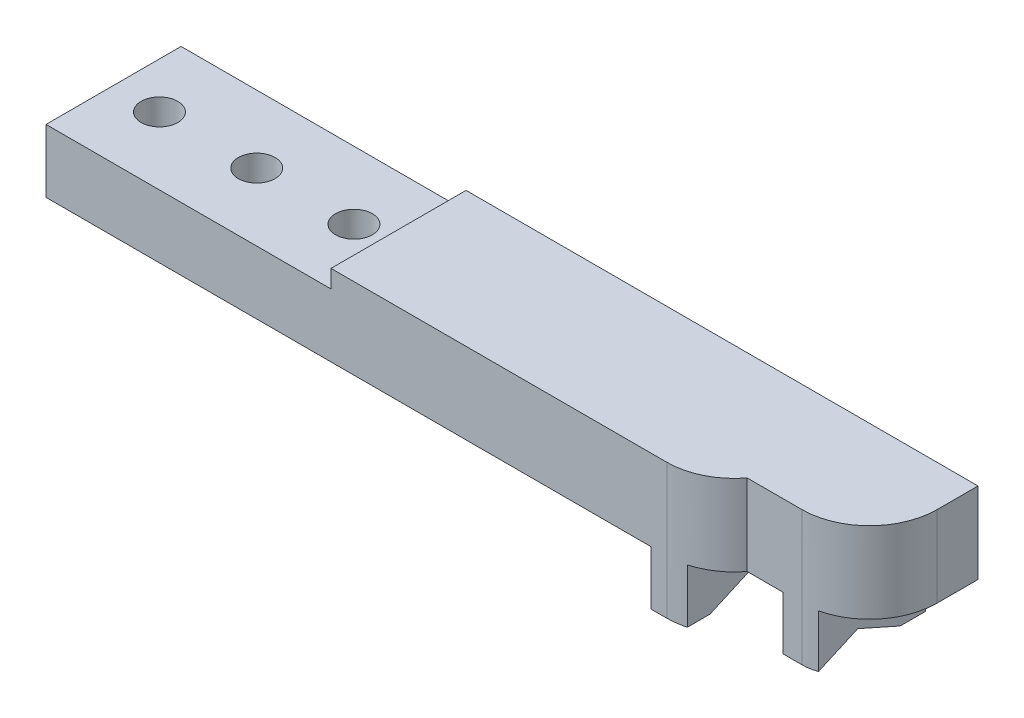
ISO-10303-21;
HEADER;
FILE_DESCRIPTION(('STEP AP214'),'2;1');
FILE_NAME('part.step','',(''),(''),'','','');
FILE_SCHEMA(('AUTOMOTIVE_DESIGN { 1 0 10303 214 1 1 1 1 }'));
ENDSEC;
DATA;
#1=APPLICATION_CONTEXT('core data for automotive mechanical design processes');
#2=APPLICATION_PROTOCOL_DEFINITION('international standard','automotive_design',2000,#1);
#3=PRODUCT_CONTEXT('',#1,'mechanical');
#4=PRODUCT('Part','Part','',(#3));
#5=PRODUCT_RELATED_PRODUCT_CATEGORY('part','',(#4));
#6=PRODUCT_DEFINITION_FORMATION('','',#4);
#7=PRODUCT_DEFINITION_CONTEXT('part definition',#1,'design');
#8=PRODUCT_DEFINITION('design','',#6,#7);
#9=PRODUCT_DEFINITION_SHAPE('','',#8);
#10=(LENGTH_UNIT() NAMED_UNIT(*) SI_UNIT(.MILLI.,.METRE.));
#11=(NAMED_UNIT(*) PLANE_ANGLE_UNIT() SI_UNIT($,.RADIAN.));
#12=(NAMED_UNIT(*) SI_UNIT($,.STERADIAN.) SOLID_ANGLE_UNIT());
#13=UNCERTAINTY_MEASURE_WITH_UNIT(LENGTH_MEASURE(1.E-05),#10,'distance_accuracy_value','');
#14=(GEOMETRIC_REPRESENTATION_CONTEXT(3) GLOBAL_UNCERTAINTY_ASSIGNED_CONTEXT((#13)) GLOBAL_UNIT_ASSIGNED_CONTEXT((#10,
#11,#12)) REPRESENTATION_CONTEXT('',''));
#15=CARTESIAN_POINT('',(0.,0.,0.));
#16=DIRECTION('',(0.,0.,1.));
#17=DIRECTION('',(1.,0.,0.));
#18=AXIS2_PLACEMENT_3D('',#15,#16,#17);
#19=CARTESIAN_POINT('',(0.,0.,0.));
#20=DIRECTION('',(0.,-1.,0.));
#21=DIRECTION('',(0.,0.,-1.));
#22=AXIS2_PLACEMENT_3D('',#19,#20,#21);
#23=PLANE('',#22);
#24=DIRECTION('',(1.,0.,0.));
#25=VECTOR('',#24,1.);
#26=CARTESIAN_POINT('',(0.,0.,10.3378));
#27=LINE('',#26,#25);
#28=CARTESIAN_POINT('',(56.896,0.,10.3378));
#29=VERTEX_POINT('',#28);
#30=CARTESIAN_POINT('',(60.071,0.,10.3378));
#31=VERTEX_POINT('',#30);
#32=EDGE_CURVE('E197',#29,#31,#27,.T.);
#33=ORIENTED_EDGE('',*,*,#32,.T.);
#34=DIRECTION('',(0.,0.,1.));
#35=VECTOR('',#34,1.);
#36=CARTESIAN_POINT('',(60.071,0.,0.));
#37=LINE('',#36,#35);
#38=CARTESIAN_POINT('',(60.071,0.,12.4690564891444));
#39=VERTEX_POINT('',#38);
#40=EDGE_CURVE('E293',#31,#39,#37,.T.);
#41=ORIENTED_EDGE('',*,*,#40,.T.);
#42=CARTESIAN_POINT('',(58.374047530819,0.,6.35));
#43=DIRECTION('',(0.,1.,0.));
#44=DIRECTION('',(0.,0.,-1.));
#45=AXIS2_PLACEMENT_3D('',#42,#43,#44);
#46=CIRCLE('',#45,6.35);
#47=CARTESIAN_POINT('',(58.374047530819,0.,12.7));
#48=VERTEX_POINT('',#47);
#49=EDGE_CURVE('E215',#48,#39,#46,.T.);
#50=ORIENTED_EDGE('',*,*,#49,.F.);
#51=DIRECTION('',(1.,0.,0.));
#52=VECTOR('',#51,1.);
#53=CARTESIAN_POINT('',(0.,0.,12.7));
#54=LINE('',#53,#52);
#55=CARTESIAN_POINT('',(56.896,0.,12.7));
#56=VERTEX_POINT('',#55);
#57=EDGE_CURVE('E285',#56,#48,#54,.T.);
#58=ORIENTED_EDGE('',*,*,#57,.F.);
#59=DIRECTION('',(0.,0.,1.));
#60=VECTOR('',#59,1.);
#61=CARTESIAN_POINT('',(56.896,0.,0.));
#62=LINE('',#61,#60);
#63=EDGE_CURVE('E313',#29,#56,#62,.T.);
#64=ORIENTED_EDGE('',*,*,#63,.F.);
#65=EDGE_LOOP('',(#33,#41,#50,#58,#64));
#66=FACE_BOUND('',#65,.T.);
#67=ADVANCED_FACE('F42',(#66),#23,.T.);
#68=CARTESIAN_POINT('',(74.93,12.7,12.7));
#69=DIRECTION('',(-1.,0.,0.));
#70=DIRECTION('',(0.,0.,1.));
#71=AXIS2_PLACEMENT_3D('',#68,#69,#70);
#72=PLANE('',#71);
#73=DIRECTION('',(0.,-1.,0.));
#74=VECTOR('',#73,1.);
#75=CARTESIAN_POINT('',(74.93,12.7,3.85));
#76=LINE('',#75,#74);
#77=CARTESIAN_POINT('',(74.93,12.7,3.85));
#78=VERTEX_POINT('',#77);
#79=CARTESIAN_POINT('',(74.93,5.08,3.85));
#80=VERTEX_POINT('',#79);
#81=EDGE_CURVE('E228',#78,#80,#76,.T.);
#82=ORIENTED_EDGE('',*,*,#81,.T.);
#83=DIRECTION('',(0.,0.,1.));
#84=VECTOR('',#83,1.);
#85=CARTESIAN_POINT('',(74.93,5.08,0.));
#86=LINE('',#85,#84);
#87=CARTESIAN_POINT('',(74.93,5.08,0.));
#88=VERTEX_POINT('',#87);
#89=EDGE_CURVE('E329',#88,#80,#86,.T.);
#90=ORIENTED_EDGE('',*,*,#89,.F.);
#91=DIRECTION('',(0.,-1.,0.));
#92=VECTOR('',#91,1.);
#93=CARTESIAN_POINT('',(74.93,12.7,0.));
#94=LINE('',#93,#92);
#95=CARTESIAN_POINT('',(74.93,12.7,0.));
#96=VERTEX_POINT('',#95);
#97=EDGE_CURVE('E359',#96,#88,#94,.T.);
#98=ORIENTED_EDGE('',*,*,#97,.F.);
#99=DIRECTION('',(0.,0.,-1.));
#100=VECTOR('',#99,1.);
#101=CARTESIAN_POINT('',(74.93,12.7,12.7));
#102=LINE('',#101,#100);
#103=EDGE_CURVE('E345',#78,#96,#102,.T.);
#104=ORIENTED_EDGE('',*,*,#103,.F.);
#105=EDGE_LOOP('',(#82,#90,#98,#104));
#106=FACE_BOUND('',#105,.T.);
#107=ADVANCED_FACE('F425',(#106),#72,.F.);
#108=DIRECTION('',(1.,0.,0.));
#109=VECTOR('',#108,1.);
#110=CARTESIAN_POINT('',(0.,0.,2.3622));
#111=LINE('',#110,#109);
#112=CARTESIAN_POINT('',(56.896,0.,2.3622));
#113=VERTEX_POINT('',#112);
#114=CARTESIAN_POINT('',(60.071,0.,2.3622));
#115=VERTEX_POINT('',#114);
#116=EDGE_CURVE('E57',#113,#115,#111,.T.);
#117=ORIENTED_EDGE('',*,*,#116,.F.);
#118=CARTESIAN_POINT('',(56.896,0.,0.));
#119=VERTEX_POINT('',#118);
#120=EDGE_CURVE('E211',#119,#113,#62,.T.);
#121=ORIENTED_EDGE('',*,*,#120,.F.);
#122=DIRECTION('',(-1.,0.,0.));
#123=VECTOR('',#122,1.);
#124=CARTESIAN_POINT('',(0.,0.,0.));
#125=LINE('',#124,#123);
#126=CARTESIAN_POINT('',(60.071,0.,0.));
#127=VERTEX_POINT('',#126);
#128=EDGE_CURVE('E354',#127,#119,#125,.T.);
#129=ORIENTED_EDGE('',*,*,#128,.F.);
#130=EDGE_CURVE('E289',#127,#115,#37,.T.);
#131=ORIENTED_EDGE('',*,*,#130,.T.);
#132=EDGE_LOOP('',(#117,#121,#129,#131));
#133=FACE_BOUND('',#132,.T.);
#134=ADVANCED_FACE('F444',(#133),#23,.T.);
#135=CARTESIAN_POINT('',(0.,12.7,12.7));
#136=DIRECTION('',(1.,0.,0.));
#137=DIRECTION('',(0.,0.,-1.));
#138=AXIS2_PLACEMENT_3D('',#135,#136,#137);
#139=PLANE('',#138);
#140=DIRECTION('',(0.,-1.,0.));
#141=VECTOR('',#140,1.);
#142=CARTESIAN_POINT('',(0.,12.7,12.7));
#143=LINE('',#142,#141);
#144=CARTESIAN_POINT('',(0.,11.0236,12.7));
#145=VERTEX_POINT('',#144);
#146=CARTESIAN_POINT('',(0.,5.08,12.7));
#147=VERTEX_POINT('',#146);
#148=EDGE_CURVE('E362',#145,#147,#143,.T.);
#149=ORIENTED_EDGE('',*,*,#148,.F.);
#150=DIRECTION('',(0.,0.,1.));
#151=VECTOR('',#150,1.);
#152=CARTESIAN_POINT('',(0.,11.0236,0.));
#153=LINE('',#152,#151);
#154=CARTESIAN_POINT('',(0.,11.0236,0.));
#155=VERTEX_POINT('',#154);
#156=EDGE_CURVE('E276',#155,#145,#153,.T.);
#157=ORIENTED_EDGE('',*,*,#156,.F.);
#158=DIRECTION('',(0.,-1.,0.));
#159=VECTOR('',#158,1.);
#160=CARTESIAN_POINT('',(0.,12.7,0.));
#161=LINE('',#160,#159);
#162=CARTESIAN_POINT('',(0.,5.08,0.));
#163=VERTEX_POINT('',#162);
#164=EDGE_CURVE('E351',#155,#163,#161,.T.);
#165=ORIENTED_EDGE('',*,*,#164,.T.);
#166=DIRECTION('',(0.,0.,1.));
#167=VECTOR('',#166,1.);
#168=CARTESIAN_POINT('',(0.,5.08,0.));
#169=LINE('',#168,#167);
#170=EDGE_CURVE('E316',#163,#147,#169,.T.);
#171=ORIENTED_EDGE('',*,*,#170,.T.);
#172=EDGE_LOOP('',(#149,#157,#165,#171));
#173=FACE_BOUND('',#172,.T.);
#174=ADVANCED_FACE('F44',(#173),#139,.F.);
#175=CARTESIAN_POINT('',(0.,12.7,12.7));
#176=DIRECTION('',(0.,0.,-1.));
#177=DIRECTION('',(-1.,0.,0.));
#178=AXIS2_PLACEMENT_3D('',#175,#176,#177);
#179=PLANE('',#178);
#180=ORIENTED_EDGE('',*,*,#57,.T.);
#181=DIRECTION('',(0.,-1.,0.));
#182=VECTOR('',#181,1.);
#183=CARTESIAN_POINT('',(58.374047530819,12.7,12.7));
#184=LINE('',#183,#182);
#185=CARTESIAN_POINT('',(58.374047530819,12.7,12.7));
#186=VERTEX_POINT('',#185);
#187=EDGE_CURVE('E238',#186,#48,#184,.T.);
#188=ORIENTED_EDGE('',*,*,#187,.F.);
#189=DIRECTION('',(1.,0.,0.));
#190=VECTOR('',#189,1.);
#191=CARTESIAN_POINT('',(0.,12.7,12.7));
#192=LINE('',#191,#190);
#193=CARTESIAN_POINT('',(26.797,12.7,12.7));
#194=VERTEX_POINT('',#193);
#195=EDGE_CURVE('E342',#194,#186,#192,.T.);
#196=ORIENTED_EDGE('',*,*,#195,.F.);
#197=DIRECTION('',(0.,1.,0.));
#198=VECTOR('',#197,1.);
#199=CARTESIAN_POINT('',(26.797,12.7,12.7));
#200=LINE('',#199,#198);
#201=CARTESIAN_POINT('',(26.797,11.0236,12.7));
#202=VERTEX_POINT('',#201);
#203=EDGE_CURVE('E273',#202,#194,#200,.T.);
#204=ORIENTED_EDGE('',*,*,#203,.F.);
#205=DIRECTION('',(1.,0.,0.));
#206=VECTOR('',#205,1.);
#207=CARTESIAN_POINT('',(0.,11.0236,12.7));
#208=LINE('',#207,#206);
#209=EDGE_CURVE('E277',#145,#202,#208,.T.);
#210=ORIENTED_EDGE('',*,*,#209,.F.);
#211=ORIENTED_EDGE('',*,*,#148,.T.);
#212=DIRECTION('',(-1.,0.,0.));
#213=VECTOR('',#212,1.);
#214=CARTESIAN_POINT('',(0.,5.08,12.7));
#215=LINE('',#214,#213);
#216=CARTESIAN_POINT('',(56.896,5.08,12.7));
#217=VERTEX_POINT('',#216);
#218=EDGE_CURVE('E320',#217,#147,#215,.T.);
#219=ORIENTED_EDGE('',*,*,#218,.F.);
#220=DIRECTION('',(0.,1.,0.));
#221=VECTOR('',#220,1.);
#222=CARTESIAN_POINT('',(56.896,0.,12.7));
#223=LINE('',#222,#221);
#224=EDGE_CURVE('E303',#56,#217,#223,.T.);
#225=ORIENTED_EDGE('',*,*,#224,.F.);
#226=EDGE_LOOP('',(#180,#188,#196,#204,#210,#211,#219,#225));
#227=FACE_BOUND('',#226,.T.);
#228=ADVANCED_FACE('F436',(#227),#179,.F.);
#229=CARTESIAN_POINT('',(0.,12.7,0.));
#230=DIRECTION('',(0.,0.,1.));
#231=DIRECTION('',(1.,0.,0.));
#232=AXIS2_PLACEMENT_3D('',#229,#230,#231);
#233=PLANE('',#232);
#234=DIRECTION('',(1.,0.,0.));
#235=VECTOR('',#234,1.);
#236=CARTESIAN_POINT('',(0.,11.0236,0.));
#237=LINE('',#236,#235);
#238=CARTESIAN_POINT('',(26.797,11.0236,0.));
#239=VERTEX_POINT('',#238);
#240=EDGE_CURVE('E269',#155,#239,#237,.T.);
#241=ORIENTED_EDGE('',*,*,#240,.T.);
#242=DIRECTION('',(0.,1.,0.));
#243=VECTOR('',#242,1.);
#244=CARTESIAN_POINT('',(26.797,12.7,0.));
#245=LINE('',#244,#243);
#246=CARTESIAN_POINT('',(26.797,12.7,0.));
#247=VERTEX_POINT('',#246);
#248=EDGE_CURVE('E272',#239,#247,#245,.T.);
#249=ORIENTED_EDGE('',*,*,#248,.T.);
#250=DIRECTION('',(-1.,0.,0.));
#251=VECTOR('',#250,1.);
#252=CARTESIAN_POINT('',(0.,12.7,0.));
#253=LINE('',#252,#251);
#254=EDGE_CURVE('E348',#96,#247,#253,.T.);
#255=ORIENTED_EDGE('',*,*,#254,.F.);
#256=ORIENTED_EDGE('',*,*,#97,.T.);
#257=DIRECTION('',(-1.,0.,0.));
#258=VECTOR('',#257,1.);
#259=CARTESIAN_POINT('',(74.93,5.08,0.));
#260=LINE('',#259,#258);
#261=CARTESIAN_POINT('',(69.977,5.08,0.));
#262=VERTEX_POINT('',#261);
#263=EDGE_CURVE('E319',#88,#262,#260,.T.);
#264=ORIENTED_EDGE('',*,*,#263,.T.);
#265=DIRECTION('',(0.,-1.,0.));
#266=VECTOR('',#265,1.);
#267=CARTESIAN_POINT('',(69.977,0.,0.));
#268=LINE('',#267,#266);
#269=CARTESIAN_POINT('',(69.977,0.,0.));
#270=VERTEX_POINT('',#269);
#271=EDGE_CURVE('E332',#262,#270,#268,.T.);
#272=ORIENTED_EDGE('',*,*,#271,.T.);
#273=CARTESIAN_POINT('',(66.802,0.,0.));
#274=VERTEX_POINT('',#273);
#275=EDGE_CURVE('E346',#270,#274,#125,.T.);
#276=ORIENTED_EDGE('',*,*,#275,.T.);
#277=DIRECTION('',(0.,1.,0.));
#278=VECTOR('',#277,1.);
#279=CARTESIAN_POINT('',(66.802,0.,0.));
#280=LINE('',#279,#278);
#281=CARTESIAN_POINT('',(66.802,5.08,0.));
#282=VERTEX_POINT('',#281);
#283=EDGE_CURVE('E306',#274,#282,#280,.T.);
#284=ORIENTED_EDGE('',*,*,#283,.T.);
#285=DIRECTION('',(-1.,0.,0.));
#286=VECTOR('',#285,1.);
#287=CARTESIAN_POINT('',(60.071,5.08,0.));
#288=LINE('',#287,#286);
#289=CARTESIAN_POINT('',(60.071,5.08,0.));
#290=VERTEX_POINT('',#289);
#291=EDGE_CURVE('E292',#282,#290,#288,.T.);
#292=ORIENTED_EDGE('',*,*,#291,.T.);
#293=DIRECTION('',(0.,-1.,0.));
#294=VECTOR('',#293,1.);
#295=CARTESIAN_POINT('',(60.071,0.,0.));
#296=LINE('',#295,#294);
#297=EDGE_CURVE('E280',#290,#127,#296,.T.);
#298=ORIENTED_EDGE('',*,*,#297,.T.);
#299=ORIENTED_EDGE('',*,*,#128,.T.);
#300=DIRECTION('',(0.,1.,0.));
#301=VECTOR('',#300,1.);
#302=CARTESIAN_POINT('',(56.896,0.,0.));
#303=LINE('',#302,#301);
#304=CARTESIAN_POINT('',(56.896,5.08,0.));
#305=VERTEX_POINT('',#304);
#306=EDGE_CURVE('E322',#119,#305,#303,.T.);
#307=ORIENTED_EDGE('',*,*,#306,.T.);
#308=DIRECTION('',(-1.,0.,0.));
#309=VECTOR('',#308,1.);
#310=CARTESIAN_POINT('',(0.,5.08,0.));
#311=LINE('',#310,#309);
#312=EDGE_CURVE('E312',#305,#163,#311,.T.);
#313=ORIENTED_EDGE('',*,*,#312,.T.);
#314=ORIENTED_EDGE('',*,*,#164,.F.);
#315=EDGE_LOOP('',(#241,#249,#255,#256,#264,#272,#276,#284,#292,#298,#299,#307,#313,#314));
#316=FACE_BOUND('',#315,.T.);
#317=ADVANCED_FACE('F420',(#316),#233,.F.);
#318=CARTESIAN_POINT('',(0.,12.7,0.));
#319=DIRECTION('',(0.,-1.,0.));
#320=DIRECTION('',(0.,0.,-1.));
#321=AXIS2_PLACEMENT_3D('',#318,#319,#320);
#322=PLANE('',#321);
#323=DIRECTION('',(1.,0.,0.));
#324=VECTOR('',#323,1.);
#325=CARTESIAN_POINT('',(68.58,12.7,10.2));
#326=LINE('',#325,#324);
#327=CARTESIAN_POINT('',(63.4238,12.7,10.2));
#328=VERTEX_POINT('',#327);
#329=CARTESIAN_POINT('',(68.58,12.7,10.2));
#330=VERTEX_POINT('',#329);
#331=EDGE_CURVE('E225',#328,#330,#326,.T.);
#332=ORIENTED_EDGE('',*,*,#331,.T.);
#333=CARTESIAN_POINT('',(68.58,12.7,3.85));
#334=DIRECTION('',(0.,1.,0.));
#335=DIRECTION('',(0.,0.,-1.));
#336=AXIS2_PLACEMENT_3D('',#333,#334,#335);
#337=CIRCLE('',#336,6.35);
#338=EDGE_CURVE('E219',#330,#78,#337,.T.);
#339=ORIENTED_EDGE('',*,*,#338,.T.);
#340=ORIENTED_EDGE('',*,*,#103,.T.);
#341=ORIENTED_EDGE('',*,*,#254,.T.);
#342=DIRECTION('',(0.,0.,1.));
#343=VECTOR('',#342,1.);
#344=CARTESIAN_POINT('',(26.797,12.7,0.));
#345=LINE('',#344,#343);
#346=EDGE_CURVE('E282',#247,#194,#345,.T.);
#347=ORIENTED_EDGE('',*,*,#346,.T.);
#348=ORIENTED_EDGE('',*,*,#195,.T.);
#349=CARTESIAN_POINT('',(58.374047530819,12.7,6.35));
#350=DIRECTION('',(0.,1.,0.));
#351=DIRECTION('',(0.,0.,-1.));
#352=AXIS2_PLACEMENT_3D('',#349,#350,#351);
#353=CIRCLE('',#352,6.35);
#354=EDGE_CURVE('E222',#186,#328,#353,.T.);
#355=ORIENTED_EDGE('',*,*,#354,.T.);
#356=EDGE_LOOP('',(#332,#339,#340,#341,#347,#348,#355));
#357=FACE_BOUND('',#356,.T.);
#358=ADVANCED_FACE('F383',(#357),#322,.F.);
#359=CARTESIAN_POINT('',(66.802,0.,2.3622));
#360=VERTEX_POINT('',#359);
#361=CARTESIAN_POINT('',(69.977,0.,2.3622));
#362=VERTEX_POINT('',#361);
#363=EDGE_CURVE('E408',#360,#362,#111,.T.);
#364=ORIENTED_EDGE('',*,*,#363,.F.);
#365=DIRECTION('',(0.,0.,1.));
#366=VECTOR('',#365,1.);
#367=CARTESIAN_POINT('',(66.802,0.,0.));
#368=LINE('',#367,#366);
#369=EDGE_CURVE('E294',#274,#360,#368,.T.);
#370=ORIENTED_EDGE('',*,*,#369,.F.);
#371=ORIENTED_EDGE('',*,*,#275,.F.);
#372=DIRECTION('',(0.,0.,1.));
#373=VECTOR('',#372,1.);
#374=CARTESIAN_POINT('',(69.977,0.,0.));
#375=LINE('',#374,#373);
#376=EDGE_CURVE('E268',#270,#362,#375,.T.);
#377=ORIENTED_EDGE('',*,*,#376,.T.);
#378=EDGE_LOOP('',(#364,#370,#371,#377));
#379=FACE_BOUND('',#378,.T.);
#380=ADVANCED_FACE('F417',(#379),#23,.T.);
#381=CARTESIAN_POINT('',(69.977,0.,0.));
#382=DIRECTION('',(-1.,0.,0.));
#383=DIRECTION('',(0.,0.,1.));
#384=AXIS2_PLACEMENT_3D('',#381,#382,#383);
#385=PLANE('',#384);
#386=DIRECTION('',(0.,-1.,0.));
#387=VECTOR('',#386,1.);
#388=CARTESIAN_POINT('',(69.977,12.7,10.0444241863147));
#389=LINE('',#388,#387);
#390=CARTESIAN_POINT('',(69.977,5.08,10.0444241863147));
#391=VERTEX_POINT('',#390);
#392=CARTESIAN_POINT('',(69.977,0.130804502917027,10.0444241863147));
#393=VERTEX_POINT('',#392);
#394=EDGE_CURVE('E247',#391,#393,#389,.T.);
#395=ORIENTED_EDGE('',*,*,#394,.T.);
#396=DIRECTION('',(0.,0.407217699388902,-0.913331125772252));
#397=VECTOR('',#396,1.);
#398=CARTESIAN_POINT('',(69.977,3.8448821279908,1.71427865579205));
#399=LINE('',#398,#397);
#400=CARTESIAN_POINT('',(69.977,1.778,6.35));
#401=VERTEX_POINT('',#400);
#402=EDGE_CURVE('E394',#393,#401,#399,.T.);
#403=ORIENTED_EDGE('',*,*,#402,.T.);
#404=DIRECTION('',(0.,-0.407217699388902,-0.913331125772253));
#405=VECTOR('',#404,1.);
#406=CARTESIAN_POINT('',(69.977,-0.878560289688323,0.391714778841903));
#407=LINE('',#406,#405);
#408=EDGE_CURVE('E212',#401,#362,#407,.T.);
#409=ORIENTED_EDGE('',*,*,#408,.T.);
#410=ORIENTED_EDGE('',*,*,#376,.F.);
#411=ORIENTED_EDGE('',*,*,#271,.F.);
#412=DIRECTION('',(0.,0.,1.));
#413=VECTOR('',#412,1.);
#414=CARTESIAN_POINT('',(69.977,5.08,0.));
#415=LINE('',#414,#413);
#416=EDGE_CURVE('E333',#262,#391,#415,.T.);
#417=ORIENTED_EDGE('',*,*,#416,.T.);
#418=EDGE_LOOP('',(#395,#403,#409,#410,#411,#417));
#419=FACE_BOUND('',#418,.T.);
#420=ADVANCED_FACE('F414',(#419),#385,.F.);
#421=CARTESIAN_POINT('',(74.93,5.08,0.));
#422=DIRECTION('',(0.,1.,0.));
#423=DIRECTION('',(-1.,0.,0.));
#424=AXIS2_PLACEMENT_3D('',#421,#422,#423);
#425=PLANE('',#424);
#426=ORIENTED_EDGE('',*,*,#89,.T.);
#427=CARTESIAN_POINT('',(68.58,5.08,3.85));
#428=DIRECTION('',(0.,1.,0.));
#429=DIRECTION('',(-1.,0.,0.));
#430=AXIS2_PLACEMENT_3D('',#427,#428,#429);
#431=CIRCLE('',#430,6.35);
#432=EDGE_CURVE('E370',#80,#391,#431,.F.);
#433=ORIENTED_EDGE('',*,*,#432,.T.);
#434=ORIENTED_EDGE('',*,*,#416,.F.);
#435=ORIENTED_EDGE('',*,*,#263,.F.);
#436=EDGE_LOOP('',(#426,#433,#434,#435));
#437=FACE_BOUND('',#436,.T.);
#438=ADVANCED_FACE('F422',(#437),#425,.F.);
#439=CARTESIAN_POINT('',(0.,5.08,0.));
#440=DIRECTION('',(0.,1.,0.));
#441=DIRECTION('',(-1.,0.,0.));
#442=AXIS2_PLACEMENT_3D('',#439,#440,#441);
#443=PLANE('',#442);
#444=CARTESIAN_POINT('',(4.318,5.08,6.35));
#445=DIRECTION('',(0.,-1.,0.));
#446=DIRECTION('',(0.,0.,-1.));
#447=AXIS2_PLACEMENT_3D('',#444,#445,#446);
#448=CIRCLE('',#447,1.7272);
#449=CARTESIAN_POINT('',(4.318,5.08,4.6228));
#450=VERTEX_POINT('',#449);
#451=EDGE_CURVE('E250',#450,#450,#448,.T.);
#452=ORIENTED_EDGE('',*,*,#451,.F.);
#453=EDGE_LOOP('',(#452));
#454=FACE_BOUND('',#453,.T.);
#455=CARTESIAN_POINT('',(13.462,5.08,6.35));
#456=DIRECTION('',(0.,-1.,0.));
#457=DIRECTION('',(0.,0.,-1.));
#458=AXIS2_PLACEMENT_3D('',#455,#456,#457);
#459=CIRCLE('',#458,1.7272);
#460=CARTESIAN_POINT('',(13.462,5.08,4.6228));
#461=VERTEX_POINT('',#460);
#462=EDGE_CURVE('E256',#461,#461,#459,.T.);
#463=ORIENTED_EDGE('',*,*,#462,.F.);
#464=EDGE_LOOP('',(#463));
#465=FACE_BOUND('',#464,.T.);
#466=CARTESIAN_POINT('',(22.606,5.08,6.35));
#467=DIRECTION('',(0.,-1.,0.));
#468=DIRECTION('',(0.,0.,-1.));
#469=AXIS2_PLACEMENT_3D('',#466,#467,#468);
#470=CIRCLE('',#469,1.7272);
#471=CARTESIAN_POINT('',(22.606,5.08,4.62280000000001));
#472=VERTEX_POINT('',#471);
#473=EDGE_CURVE('E262',#472,#472,#470,.T.);
#474=ORIENTED_EDGE('',*,*,#473,.F.);
#475=EDGE_LOOP('',(#474));
#476=FACE_BOUND('',#475,.T.);
#477=ORIENTED_EDGE('',*,*,#218,.T.);
#478=ORIENTED_EDGE('',*,*,#170,.F.);
#479=ORIENTED_EDGE('',*,*,#312,.F.);
#480=DIRECTION('',(0.,0.,1.));
#481=VECTOR('',#480,1.);
#482=CARTESIAN_POINT('',(56.896,5.08,0.));
#483=LINE('',#482,#481);
#484=EDGE_CURVE('E314',#305,#217,#483,.T.);
#485=ORIENTED_EDGE('',*,*,#484,.T.);
#486=EDGE_LOOP('',(#477,#478,#479,#485));
#487=FACE_BOUND('',#486,.T.);
#488=ADVANCED_FACE('F501',(#454,#465,#476,#487),#443,.F.);
#489=CARTESIAN_POINT('',(56.896,0.,0.));
#490=DIRECTION('',(1.,0.,0.));
#491=DIRECTION('',(0.,0.,-1.));
#492=AXIS2_PLACEMENT_3D('',#489,#490,#491);
#493=PLANE('',#492);
#494=DIRECTION('',(0.,0.407217699388902,0.913331125772253));
#495=VECTOR('',#494,1.);
#496=CARTESIAN_POINT('',(56.896,-0.878560289688325,0.3917147788419));
#497=LINE('',#496,#495);
#498=CARTESIAN_POINT('',(56.896,1.778,6.35));
#499=VERTEX_POINT('',#498);
#500=EDGE_CURVE('E205',#113,#499,#497,.T.);
#501=ORIENTED_EDGE('',*,*,#500,.T.);
#502=DIRECTION('',(0.,-0.407217699388902,0.913331125772252));
#503=VECTOR('',#502,1.);
#504=CARTESIAN_POINT('',(56.896,3.8448821279908,1.71427865579206));
#505=LINE('',#504,#503);
#506=EDGE_CURVE('E191',#499,#29,#505,.T.);
#507=ORIENTED_EDGE('',*,*,#506,.T.);
#508=ORIENTED_EDGE('',*,*,#63,.T.);
#509=ORIENTED_EDGE('',*,*,#224,.T.);
#510=ORIENTED_EDGE('',*,*,#484,.F.);
#511=ORIENTED_EDGE('',*,*,#306,.F.);
#512=ORIENTED_EDGE('',*,*,#120,.T.);
#513=EDGE_LOOP('',(#501,#507,#508,#509,#510,#511,#512));
#514=FACE_BOUND('',#513,.T.);
#515=ADVANCED_FACE('F209',(#514),#493,.F.);
#516=CARTESIAN_POINT('',(60.071,0.,0.));
#517=DIRECTION('',(-1.,0.,0.));
#518=DIRECTION('',(0.,0.,1.));
#519=AXIS2_PLACEMENT_3D('',#516,#517,#518);
#520=PLANE('',#519);
#521=ORIENTED_EDGE('',*,*,#40,.F.);
#522=DIRECTION('',(0.,0.407217699388902,-0.913331125772252));
#523=VECTOR('',#522,1.);
#524=CARTESIAN_POINT('',(60.071,3.8448821279908,1.71427865579206));
#525=LINE('',#524,#523);
#526=CARTESIAN_POINT('',(60.071,1.778,6.35));
#527=VERTEX_POINT('',#526);
#528=EDGE_CURVE('E202',#31,#527,#525,.T.);
#529=ORIENTED_EDGE('',*,*,#528,.T.);
#530=DIRECTION('',(0.,-0.407217699388902,-0.913331125772253));
#531=VECTOR('',#530,1.);
#532=CARTESIAN_POINT('',(60.071,-0.878560289688324,0.391714778841902));
#533=LINE('',#532,#531);
#534=EDGE_CURVE('E201',#527,#115,#533,.T.);
#535=ORIENTED_EDGE('',*,*,#534,.T.);
#536=ORIENTED_EDGE('',*,*,#130,.F.);
#537=ORIENTED_EDGE('',*,*,#297,.F.);
#538=DIRECTION('',(0.,0.,1.));
#539=VECTOR('',#538,1.);
#540=CARTESIAN_POINT('',(60.071,5.08,0.));
#541=LINE('',#540,#539);
#542=CARTESIAN_POINT('',(60.071,5.08,12.4690564891444));
#543=VERTEX_POINT('',#542);
#544=EDGE_CURVE('E300',#290,#543,#541,.T.);
#545=ORIENTED_EDGE('',*,*,#544,.T.);
#546=DIRECTION('',(0.,-1.,0.));
#547=VECTOR('',#546,1.);
#548=CARTESIAN_POINT('',(60.071,12.7,12.4690564891444));
#549=LINE('',#548,#547);
#550=EDGE_CURVE('E244',#543,#39,#549,.T.);
#551=ORIENTED_EDGE('',*,*,#550,.T.);
#552=EDGE_LOOP('',(#521,#529,#535,#536,#537,#545,#551));
#553=FACE_BOUND('',#552,.T.);
#554=ADVANCED_FACE('F403',(#553),#520,.F.);
#555=CARTESIAN_POINT('',(60.071,5.08,0.));
#556=DIRECTION('',(0.,1.,0.));
#557=DIRECTION('',(-1.,0.,0.));
#558=AXIS2_PLACEMENT_3D('',#555,#556,#557);
#559=PLANE('',#558);
#560=DIRECTION('',(0.,0.,1.));
#561=VECTOR('',#560,1.);
#562=CARTESIAN_POINT('',(66.802,5.08,0.));
#563=LINE('',#562,#561);
#564=CARTESIAN_POINT('',(66.802,5.08,10.2));
#565=VERTEX_POINT('',#564);
#566=EDGE_CURVE('E297',#282,#565,#563,.T.);
#567=ORIENTED_EDGE('',*,*,#566,.T.);
#568=DIRECTION('',(-1.,0.,0.));
#569=VECTOR('',#568,1.);
#570=CARTESIAN_POINT('',(60.071,5.08,10.2));
#571=LINE('',#570,#569);
#572=CARTESIAN_POINT('',(63.4238,5.08,10.2));
#573=VERTEX_POINT('',#572);
#574=EDGE_CURVE('E234',#565,#573,#571,.T.);
#575=ORIENTED_EDGE('',*,*,#574,.T.);
#576=CARTESIAN_POINT('',(58.374047530819,5.08,6.35));
#577=DIRECTION('',(0.,1.,0.));
#578=DIRECTION('',(-1.,0.,0.));
#579=AXIS2_PLACEMENT_3D('',#576,#577,#578);
#580=CIRCLE('',#579,6.35);
#581=EDGE_CURVE('E367',#573,#543,#580,.F.);
#582=ORIENTED_EDGE('',*,*,#581,.T.);
#583=ORIENTED_EDGE('',*,*,#544,.F.);
#584=ORIENTED_EDGE('',*,*,#291,.F.);
#585=EDGE_LOOP('',(#567,#575,#582,#583,#584));
#586=FACE_BOUND('',#585,.T.);
#587=ADVANCED_FACE('F386',(#586),#559,.F.);
#588=CARTESIAN_POINT('',(66.802,0.,0.));
#589=DIRECTION('',(1.,0.,0.));
#590=DIRECTION('',(0.,0.,-1.));
#591=AXIS2_PLACEMENT_3D('',#588,#589,#590);
#592=PLANE('',#591);
#593=DIRECTION('',(0.,0.407217699388902,0.913331125772253));
#594=VECTOR('',#593,1.);
#595=CARTESIAN_POINT('',(66.802,-0.878560289688324,0.391714778841903));
#596=LINE('',#595,#594);
#597=CARTESIAN_POINT('',(66.802,1.778,6.35));
#598=VERTEX_POINT('',#597);
#599=EDGE_CURVE('E11',#360,#598,#596,.T.);
#600=ORIENTED_EDGE('',*,*,#599,.T.);
#601=DIRECTION('',(0.,-0.407217699388902,0.913331125772252));
#602=VECTOR('',#601,1.);
#603=CARTESIAN_POINT('',(66.802,3.8448821279908,1.71427865579205));
#604=LINE('',#603,#602);
#605=CARTESIAN_POINT('',(66.802,0.0614394904458575,10.2));
#606=VERTEX_POINT('',#605);
#607=EDGE_CURVE('E391',#598,#606,#604,.T.);
#608=ORIENTED_EDGE('',*,*,#607,.T.);
#609=DIRECTION('',(0.,1.,0.));
#610=VECTOR('',#609,1.);
#611=CARTESIAN_POINT('',(66.802,0.,10.2));
#612=LINE('',#611,#610);
#613=EDGE_CURVE('E365',#606,#565,#612,.T.);
#614=ORIENTED_EDGE('',*,*,#613,.T.);
#615=ORIENTED_EDGE('',*,*,#566,.F.);
#616=ORIENTED_EDGE('',*,*,#283,.F.);
#617=ORIENTED_EDGE('',*,*,#369,.T.);
#618=EDGE_LOOP('',(#600,#608,#614,#615,#616,#617));
#619=FACE_BOUND('',#618,.T.);
#620=ADVANCED_FACE('F389',(#619),#592,.F.);
#621=CARTESIAN_POINT('',(26.797,12.7,0.));
#622=DIRECTION('',(1.,0.,0.));
#623=DIRECTION('',(0.,0.,-1.));
#624=AXIS2_PLACEMENT_3D('',#621,#622,#623);
#625=PLANE('',#624);
#626=ORIENTED_EDGE('',*,*,#203,.T.);
#627=ORIENTED_EDGE('',*,*,#346,.F.);
#628=ORIENTED_EDGE('',*,*,#248,.F.);
#629=DIRECTION('',(0.,0.,1.));
#630=VECTOR('',#629,1.);
#631=CARTESIAN_POINT('',(26.797,11.0236,0.));
#632=LINE('',#631,#630);
#633=EDGE_CURVE('E286',#239,#202,#632,.T.);
#634=ORIENTED_EDGE('',*,*,#633,.T.);
#635=EDGE_LOOP('',(#626,#627,#628,#634));
#636=FACE_BOUND('',#635,.T.);
#637=ADVANCED_FACE('F432',(#636),#625,.F.);
#638=CARTESIAN_POINT('',(0.,11.0236,0.));
#639=DIRECTION('',(0.,-1.,0.));
#640=DIRECTION('',(0.,0.,-1.));
#641=AXIS2_PLACEMENT_3D('',#638,#639,#640);
#642=PLANE('',#641);
#643=CARTESIAN_POINT('',(4.318,11.0236,6.35));
#644=DIRECTION('',(0.,-1.,0.));
#645=DIRECTION('',(0.,0.,-1.));
#646=AXIS2_PLACEMENT_3D('',#643,#644,#645);
#647=CIRCLE('',#646,1.7272);
#648=CARTESIAN_POINT('',(4.318,11.0236,4.62280000000001));
#649=VERTEX_POINT('',#648);
#650=EDGE_CURVE('E253',#649,#649,#647,.T.);
#651=ORIENTED_EDGE('',*,*,#650,.T.);
#652=EDGE_LOOP('',(#651));
#653=FACE_BOUND('',#652,.T.);
#654=CARTESIAN_POINT('',(13.462,11.0236,6.35));
#655=DIRECTION('',(0.,-1.,0.));
#656=DIRECTION('',(0.,0.,-1.));
#657=AXIS2_PLACEMENT_3D('',#654,#655,#656);
#658=CIRCLE('',#657,1.7272);
#659=CARTESIAN_POINT('',(13.462,11.0236,4.6228));
#660=VERTEX_POINT('',#659);
#661=EDGE_CURVE('E259',#660,#660,#658,.T.);
#662=ORIENTED_EDGE('',*,*,#661,.T.);
#663=EDGE_LOOP('',(#662));
#664=FACE_BOUND('',#663,.T.);
#665=CARTESIAN_POINT('',(22.606,11.0236,6.35));
#666=DIRECTION('',(0.,-1.,0.));
#667=DIRECTION('',(0.,0.,-1.));
#668=AXIS2_PLACEMENT_3D('',#665,#666,#667);
#669=CIRCLE('',#668,1.7272);
#670=CARTESIAN_POINT('',(22.606,11.0236,4.62280000000001));
#671=VERTEX_POINT('',#670);
#672=EDGE_CURVE('E265',#671,#671,#669,.T.);
#673=ORIENTED_EDGE('',*,*,#672,.T.);
#674=EDGE_LOOP('',(#673));
#675=FACE_BOUND('',#674,.T.);
#676=ORIENTED_EDGE('',*,*,#209,.T.);
#677=ORIENTED_EDGE('',*,*,#633,.F.);
#678=ORIENTED_EDGE('',*,*,#240,.F.);
#679=ORIENTED_EDGE('',*,*,#156,.T.);
#680=EDGE_LOOP('',(#676,#677,#678,#679));
#681=FACE_BOUND('',#680,.T.);
#682=ADVANCED_FACE('F622',(#653,#664,#675,#681),#642,.F.);
#683=CARTESIAN_POINT('',(22.606,5.08,6.35));
#684=DIRECTION('',(0.,-1.,0.));
#685=DIRECTION('',(0.,0.,-1.));
#686=AXIS2_PLACEMENT_3D('',#683,#684,#685);
#687=CYLINDRICAL_SURFACE('',#686,1.7272);
#688=ORIENTED_EDGE('',*,*,#473,.T.);
#689=EDGE_LOOP('',(#688));
#690=FACE_BOUND('',#689,.T.);
#691=ORIENTED_EDGE('',*,*,#672,.F.);
#692=EDGE_LOOP('',(#691));
#693=FACE_BOUND('',#692,.T.);
#694=ADVANCED_FACE('F610',(#690,#693),#687,.F.);
#695=CARTESIAN_POINT('',(13.462,5.08,6.35));
#696=DIRECTION('',(0.,-1.,0.));
#697=DIRECTION('',(0.,0.,-1.));
#698=AXIS2_PLACEMENT_3D('',#695,#696,#697);
#699=CYLINDRICAL_SURFACE('',#698,1.7272);
#700=ORIENTED_EDGE('',*,*,#462,.T.);
#701=EDGE_LOOP('',(#700));
#702=FACE_BOUND('',#701,.T.);
#703=ORIENTED_EDGE('',*,*,#661,.F.);
#704=EDGE_LOOP('',(#703));
#705=FACE_BOUND('',#704,.T.);
#706=ADVANCED_FACE('F601',(#702,#705),#699,.F.);
#707=CARTESIAN_POINT('',(4.318,5.08,6.35));
#708=DIRECTION('',(0.,-1.,0.));
#709=DIRECTION('',(0.,0.,-1.));
#710=AXIS2_PLACEMENT_3D('',#707,#708,#709);
#711=CYLINDRICAL_SURFACE('',#710,1.7272);
#712=ORIENTED_EDGE('',*,*,#451,.T.);
#713=EDGE_LOOP('',(#712));
#714=FACE_BOUND('',#713,.T.);
#715=ORIENTED_EDGE('',*,*,#650,.F.);
#716=EDGE_LOOP('',(#715));
#717=FACE_BOUND('',#716,.T.);
#718=ADVANCED_FACE('F472',(#714,#717),#711,.F.);
#719=CARTESIAN_POINT('',(68.58,12.7,3.85));
#720=DIRECTION('',(0.,-1.,0.));
#721=DIRECTION('',(0.,0.,-1.));
#722=AXIS2_PLACEMENT_3D('',#719,#720,#721);
#723=CYLINDRICAL_SURFACE('',#722,6.35);
#724=DIRECTION('',(0.,-1.,0.));
#725=VECTOR('',#724,1.);
#726=CARTESIAN_POINT('',(68.58,12.7,10.2));
#727=LINE('',#726,#725);
#728=CARTESIAN_POINT('',(68.58,0.0614394904458575,10.2));
#729=VERTEX_POINT('',#728);
#730=EDGE_CURVE('E231',#330,#729,#727,.T.);
#731=ORIENTED_EDGE('',*,*,#730,.T.);
#732=CARTESIAN_POINT('',(68.58,2.89264968152866,3.85));
#733=DIRECTION('',(0.,0.913331125772252,0.407217699388902));
#734=DIRECTION('',(0.,-0.407217699388902,0.913331125772252));
#735=AXIS2_PLACEMENT_3D('',#732,#733,#734);
#736=ELLIPSE('',#735,6.95257154915296,6.35);
#737=EDGE_CURVE('E65',#729,#393,#736,.T.);
#738=ORIENTED_EDGE('',*,*,#737,.T.);
#739=ORIENTED_EDGE('',*,*,#394,.F.);
#740=ORIENTED_EDGE('',*,*,#432,.F.);
#741=ORIENTED_EDGE('',*,*,#81,.F.);
#742=ORIENTED_EDGE('',*,*,#338,.F.);
#743=EDGE_LOOP('',(#731,#738,#739,#740,#741,#742));
#744=FACE_BOUND('',#743,.T.);
#745=ADVANCED_FACE('F380',(#744),#723,.T.);
#746=CARTESIAN_POINT('',(58.374047530819,12.7,6.35));
#747=DIRECTION('',(0.,-1.,0.));
#748=DIRECTION('',(0.,0.,-1.));
#749=AXIS2_PLACEMENT_3D('',#746,#747,#748);
#750=CYLINDRICAL_SURFACE('',#749,6.35);
#751=ORIENTED_EDGE('',*,*,#581,.F.);
#752=DIRECTION('',(0.,-1.,0.));
#753=VECTOR('',#752,1.);
#754=CARTESIAN_POINT('',(63.4238,12.7,10.2));
#755=LINE('',#754,#753);
#756=EDGE_CURVE('E235',#328,#573,#755,.T.);
#757=ORIENTED_EDGE('',*,*,#756,.F.);
#758=ORIENTED_EDGE('',*,*,#354,.F.);
#759=ORIENTED_EDGE('',*,*,#187,.T.);
#760=ORIENTED_EDGE('',*,*,#49,.T.);
#761=ORIENTED_EDGE('',*,*,#550,.F.);
#762=EDGE_LOOP('',(#751,#757,#758,#759,#760,#761));
#763=FACE_BOUND('',#762,.T.);
#764=ADVANCED_FACE('F440',(#763),#750,.T.);
#765=CARTESIAN_POINT('',(68.58,12.7,10.2));
#766=DIRECTION('',(0.,0.,-1.));
#767=DIRECTION('',(-1.,0.,0.));
#768=AXIS2_PLACEMENT_3D('',#765,#766,#767);
#769=PLANE('',#768);
#770=ORIENTED_EDGE('',*,*,#613,.F.);
#771=DIRECTION('',(1.,0.,0.));
#772=VECTOR('',#771,1.);
#773=CARTESIAN_POINT('',(68.58,0.0614394904458575,10.2));
#774=LINE('',#773,#772);
#775=EDGE_CURVE('E50',#606,#729,#774,.T.);
#776=ORIENTED_EDGE('',*,*,#775,.T.);
#777=ORIENTED_EDGE('',*,*,#730,.F.);
#778=ORIENTED_EDGE('',*,*,#331,.F.);
#779=ORIENTED_EDGE('',*,*,#756,.T.);
#780=ORIENTED_EDGE('',*,*,#574,.F.);
#781=EDGE_LOOP('',(#770,#776,#777,#778,#779,#780));
#782=FACE_BOUND('',#781,.T.);
#783=ADVANCED_FACE('F374',(#782),#769,.F.);
#784=CARTESIAN_POINT('',(0.,1.778,6.35));
#785=DIRECTION('',(0.,0.913331125772252,0.407217699388902));
#786=DIRECTION('',(0.,-0.407217699388902,0.913331125772252));
#787=AXIS2_PLACEMENT_3D('',#784,#785,#786);
#788=PLANE('',#787);
#789=ORIENTED_EDGE('',*,*,#737,.F.);
#790=ORIENTED_EDGE('',*,*,#775,.F.);
#791=ORIENTED_EDGE('',*,*,#607,.F.);
#792=DIRECTION('',(1.,0.,0.));
#793=VECTOR('',#792,1.);
#794=CARTESIAN_POINT('',(0.,1.778,6.35));
#795=LINE('',#794,#793);
#796=EDGE_CURVE('E206',#598,#401,#795,.T.);
#797=ORIENTED_EDGE('',*,*,#796,.T.);
#798=ORIENTED_EDGE('',*,*,#402,.F.);
#799=EDGE_LOOP('',(#789,#790,#791,#797,#798));
#800=FACE_BOUND('',#799,.T.);
#801=ADVANCED_FACE('F541',(#800),#788,.F.);
#802=CARTESIAN_POINT('',(0.,0.,2.3622));
#803=DIRECTION('',(0.,0.913331125772253,-0.407217699388902));
#804=DIRECTION('',(0.,0.407217699388902,0.913331125772253));
#805=AXIS2_PLACEMENT_3D('',#802,#803,#804);
#806=PLANE('',#805);
#807=ORIENTED_EDGE('',*,*,#796,.F.);
#808=ORIENTED_EDGE('',*,*,#599,.F.);
#809=ORIENTED_EDGE('',*,*,#363,.T.);
#810=ORIENTED_EDGE('',*,*,#408,.F.);
#811=EDGE_LOOP('',(#807,#808,#809,#810));
#812=FACE_BOUND('',#811,.T.);
#813=ADVANCED_FACE('F411',(#812),#806,.F.);
#814=ORIENTED_EDGE('',*,*,#116,.T.);
#815=ORIENTED_EDGE('',*,*,#534,.F.);
#816=EDGE_CURVE('E194',#499,#527,#795,.T.);
#817=ORIENTED_EDGE('',*,*,#816,.F.);
#818=ORIENTED_EDGE('',*,*,#500,.F.);
#819=EDGE_LOOP('',(#814,#815,#817,#818));
#820=FACE_BOUND('',#819,.T.);
#821=ADVANCED_FACE('F204',(#820),#806,.F.);
#822=ORIENTED_EDGE('',*,*,#816,.T.);
#823=ORIENTED_EDGE('',*,*,#528,.F.);
#824=ORIENTED_EDGE('',*,*,#32,.F.);
#825=ORIENTED_EDGE('',*,*,#506,.F.);
#826=EDGE_LOOP('',(#822,#823,#824,#825));
#827=FACE_BOUND('',#826,.T.);
#828=ADVANCED_FACE('F193',(#827),#788,.F.);
#829=CLOSED_SHELL('',(#67,#107,#134,#174,#228,#317,#358,#380,#420,#438,#488,#515,#554,#587,#620,
#637,#682,#694,#706,#718,#745,#764,#783,#801,#813,#821,#828));
#830=MANIFOLD_SOLID_BREP('B2',#829);
#831=ADVANCED_BREP_SHAPE_REPRESENTATION('',(#18,#830),#14);
#832=SHAPE_DEFINITION_REPRESENTATION(#9,#831);
ENDSEC;
END-ISO-10303-21;
